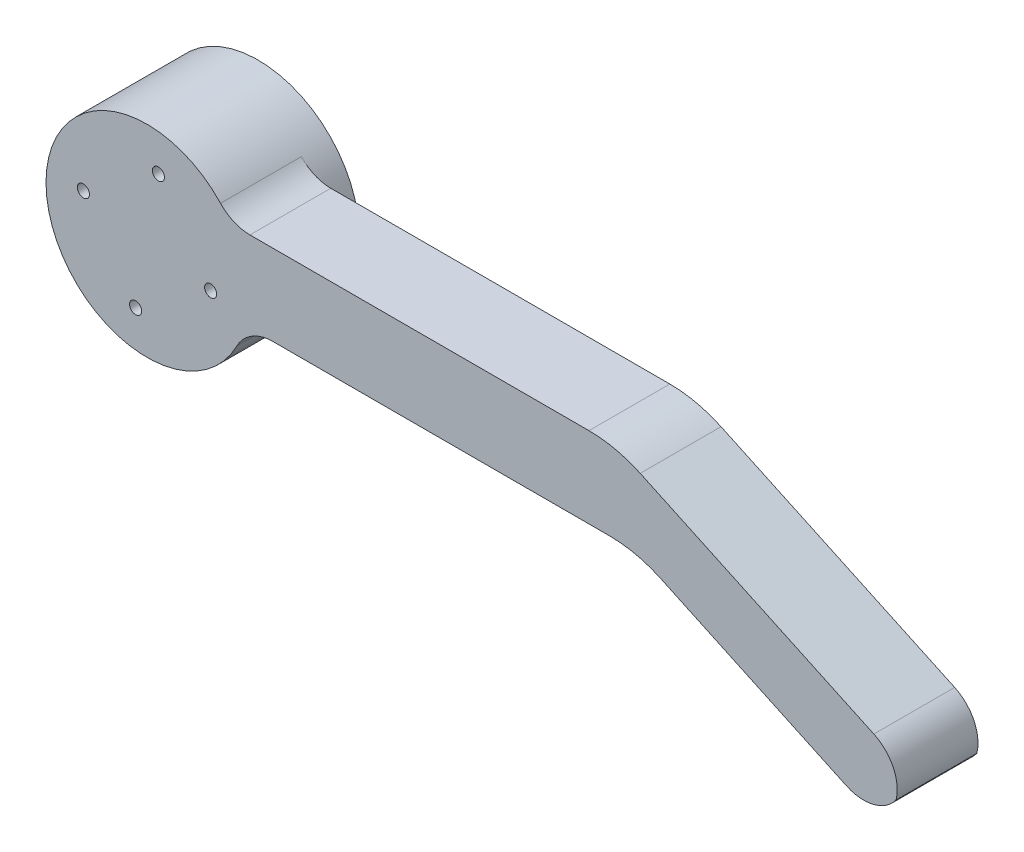
ISO-10303-21;
HEADER;
FILE_DESCRIPTION(('STEP AP214'),'2;1');
FILE_NAME('part.step','',(''),(''),'','','');
FILE_SCHEMA(('AUTOMOTIVE_DESIGN { 1 0 10303 214 1 1 1 1 }'));
ENDSEC;
DATA;
#1=APPLICATION_CONTEXT('core data for automotive mechanical design processes');
#2=APPLICATION_PROTOCOL_DEFINITION('international standard','automotive_design',2000,#1);
#3=PRODUCT_CONTEXT('',#1,'mechanical');
#4=PRODUCT('Part','Part','',(#3));
#5=PRODUCT_RELATED_PRODUCT_CATEGORY('part','',(#4));
#6=PRODUCT_DEFINITION_FORMATION('','',#4);
#7=PRODUCT_DEFINITION_CONTEXT('part definition',#1,'design');
#8=PRODUCT_DEFINITION('design','',#6,#7);
#9=PRODUCT_DEFINITION_SHAPE('','',#8);
#10=(LENGTH_UNIT() NAMED_UNIT(*) SI_UNIT(.MILLI.,.METRE.));
#11=(NAMED_UNIT(*) PLANE_ANGLE_UNIT() SI_UNIT($,.RADIAN.));
#12=(NAMED_UNIT(*) SI_UNIT($,.STERADIAN.) SOLID_ANGLE_UNIT());
#13=UNCERTAINTY_MEASURE_WITH_UNIT(LENGTH_MEASURE(1.E-05),#10,'distance_accuracy_value','');
#14=(GEOMETRIC_REPRESENTATION_CONTEXT(3) GLOBAL_UNCERTAINTY_ASSIGNED_CONTEXT((#13)) GLOBAL_UNIT_ASSIGNED_CONTEXT((#10,
#11,#12)) REPRESENTATION_CONTEXT('',''));
#15=CARTESIAN_POINT('',(0.,0.,0.));
#16=DIRECTION('',(0.,0.,1.));
#17=DIRECTION('',(1.,0.,0.));
#18=AXIS2_PLACEMENT_3D('',#15,#16,#17);
#19=CARTESIAN_POINT('',(0.,0.,-5.));
#20=DIRECTION('',(0.,0.,1.));
#21=DIRECTION('',(1.,0.,0.));
#22=AXIS2_PLACEMENT_3D('',#19,#20,#21);
#23=PLANE('',#22);
#24=CARTESIAN_POINT('',(7.87467997787572,-1.41046632217698,-5.));
#25=DIRECTION('',(0.,0.,-1.));
#26=DIRECTION('',(-1.,0.,0.));
#27=AXIS2_PLACEMENT_3D('',#24,#25,#26);
#28=CIRCLE('',#27,0.750000000000339);
#29=CARTESIAN_POINT('',(7.12467997787538,-1.41046632217698,-5.));
#30=VERTEX_POINT('',#29);
#31=EDGE_CURVE('E234',#30,#30,#28,.T.);
#32=ORIENTED_EDGE('',*,*,#31,.F.);
#33=EDGE_LOOP('',(#32));
#34=FACE_BOUND('',#33,.T.);
#35=CARTESIAN_POINT('',(-1.41046632217724,-7.87467997787591,-5.));
#36=DIRECTION('',(0.,0.,-1.));
#37=DIRECTION('',(-1.,0.,0.));
#38=AXIS2_PLACEMENT_3D('',#35,#36,#37);
#39=CIRCLE('',#38,0.750000000000507);
#40=CARTESIAN_POINT('',(-2.16046632217775,-7.87467997787591,-5.));
#41=VERTEX_POINT('',#40);
#42=EDGE_CURVE('E228',#41,#41,#39,.T.);
#43=ORIENTED_EDGE('',*,*,#42,.F.);
#44=EDGE_LOOP('',(#43));
#45=FACE_BOUND('',#44,.T.);
#46=CARTESIAN_POINT('',(-7.87467997787617,1.41046632217706,-5.));
#47=DIRECTION('',(0.,0.,-1.));
#48=DIRECTION('',(-1.,0.,0.));
#49=AXIS2_PLACEMENT_3D('',#46,#47,#48);
#50=CIRCLE('',#49,0.750000000000227);
#51=CARTESIAN_POINT('',(-8.6246799778764,1.41046632217706,-5.));
#52=VERTEX_POINT('',#51);
#53=EDGE_CURVE('E222',#52,#52,#50,.T.);
#54=ORIENTED_EDGE('',*,*,#53,.F.);
#55=EDGE_LOOP('',(#54));
#56=FACE_BOUND('',#55,.T.);
#57=CARTESIAN_POINT('',(1.41046632217679,7.87467997787599,-5.));
#58=DIRECTION('',(0.,0.,-1.));
#59=DIRECTION('',(-1.,0.,0.));
#60=AXIS2_PLACEMENT_3D('',#57,#58,#59);
#61=CIRCLE('',#60,0.75);
#62=CARTESIAN_POINT('',(0.660466322176793,7.87467997787599,-5.));
#63=VERTEX_POINT('',#62);
#64=EDGE_CURVE('E211',#63,#63,#61,.T.);
#65=ORIENTED_EDGE('',*,*,#64,.F.);
#66=EDGE_LOOP('',(#65));
#67=FACE_BOUND('',#66,.T.);
#68=CARTESIAN_POINT('',(0.,0.,-5.));
#69=DIRECTION('',(0.,0.,-1.));
#70=DIRECTION('',(-1.,0.,0.));
#71=AXIS2_PLACEMENT_3D('',#68,#69,#70);
#72=CIRCLE('',#71,10.5);
#73=CARTESIAN_POINT('',(-10.5,0.,-5.));
#74=VERTEX_POINT('',#73);
#75=EDGE_CURVE('E326',#74,#74,#72,.T.);
#76=ORIENTED_EDGE('',*,*,#75,.T.);
#77=EDGE_LOOP('',(#76));
#78=FACE_BOUND('',#77,.T.);
#79=ADVANCED_FACE('F33',(#34,#45,#56,#67,#78),#23,.F.);
#80=CARTESIAN_POINT('',(58.0156004897935,7.,5.));
#81=DIRECTION('',(-0.4226182617407,-0.90630778703665,0.));
#82=DIRECTION('',(0.90630778703665,-0.4226182617407,0.));
#83=AXIS2_PLACEMENT_3D('',#80,#81,#82);
#84=PLANE('',#83);
#85=DIRECTION('',(-0.90630778703665,0.4226182617407,0.));
#86=VECTOR('',#85,1.);
#87=CARTESIAN_POINT('',(58.0156004897935,7.,5.));
#88=LINE('',#87,#86);
#89=CARTESIAN_POINT('',(89.9406792032727,-7.8869086912965,5.));
#90=VERTEX_POINT('',#89);
#91=CARTESIAN_POINT('',(61.0294544762599,5.59461680554974,5.));
#92=VERTEX_POINT('',#91);
#93=EDGE_CURVE('E190',#90,#92,#88,.T.);
#94=ORIENTED_EDGE('',*,*,#93,.F.);
#95=DIRECTION('',(0.,0.,-1.));
#96=VECTOR('',#95,1.);
#97=CARTESIAN_POINT('',(89.9406792032727,-7.8869086912965,5.));
#98=LINE('',#97,#96);
#99=CARTESIAN_POINT('',(89.9406792032727,-7.8869086912965,-5.));
#100=VERTEX_POINT('',#99);
#101=EDGE_CURVE('E179',#90,#100,#98,.T.);
#102=ORIENTED_EDGE('',*,*,#101,.T.);
#103=DIRECTION('',(-0.90630778703665,0.4226182617407,0.));
#104=VECTOR('',#103,1.);
#105=CARTESIAN_POINT('',(58.0156004897935,7.,-5.));
#106=LINE('',#105,#104);
#107=CARTESIAN_POINT('',(61.0294544762599,5.59461680554974,-5.));
#108=VERTEX_POINT('',#107);
#109=EDGE_CURVE('E205',#100,#108,#106,.T.);
#110=ORIENTED_EDGE('',*,*,#109,.T.);
#111=DIRECTION('',(0.,0.,-1.));
#112=VECTOR('',#111,1.);
#113=CARTESIAN_POINT('',(61.0294544762599,5.59461680554974,5.));
#114=LINE('',#113,#112);
#115=EDGE_CURVE('E170',#108,#92,#114,.F.);
#116=ORIENTED_EDGE('',*,*,#115,.T.);
#117=EDGE_LOOP('',(#94,#102,#110,#116));
#118=FACE_BOUND('',#117,.T.);
#119=ADVANCED_FACE('F195',(#118),#84,.F.);
#120=CARTESIAN_POINT('',(10.356157588604,7.,5.));
#121=DIRECTION('',(0.,-1.,0.));
#122=DIRECTION('',(0.,0.,-1.));
#123=AXIS2_PLACEMENT_3D('',#120,#121,#122);
#124=PLANE('',#123);
#125=DIRECTION('',(-1.,0.,0.));
#126=VECTOR('',#125,1.);
#127=CARTESIAN_POINT('',(10.356157588604,7.,5.));
#128=LINE('',#127,#126);
#129=CARTESIAN_POINT('',(54.6901805501494,7.,5.));
#130=VERTEX_POINT('',#129);
#131=CARTESIAN_POINT('',(12.737739202857,7.,5.));
#132=VERTEX_POINT('',#131);
#133=EDGE_CURVE('E199',#130,#132,#128,.T.);
#134=ORIENTED_EDGE('',*,*,#133,.F.);
#135=DIRECTION('',(0.,0.,-1.));
#136=VECTOR('',#135,1.);
#137=CARTESIAN_POINT('',(54.6901805501494,7.,5.));
#138=LINE('',#137,#136);
#139=CARTESIAN_POINT('',(54.6901805501494,7.,-5.));
#140=VERTEX_POINT('',#139);
#141=EDGE_CURVE('E164',#130,#140,#138,.T.);
#142=ORIENTED_EDGE('',*,*,#141,.T.);
#143=DIRECTION('',(-1.,0.,0.));
#144=VECTOR('',#143,1.);
#145=CARTESIAN_POINT('',(10.356157588604,7.,-5.));
#146=LINE('',#145,#144);
#147=CARTESIAN_POINT('',(12.737739202857,7.,-5.));
#148=VERTEX_POINT('',#147);
#149=EDGE_CURVE('E208',#140,#148,#146,.T.);
#150=ORIENTED_EDGE('',*,*,#149,.T.);
#151=DIRECTION('',(0.,0.,1.));
#152=VECTOR('',#151,1.);
#153=CARTESIAN_POINT('',(12.737739202857,7.,5.));
#154=LINE('',#153,#152);
#155=EDGE_CURVE('E137',#148,#132,#154,.T.);
#156=ORIENTED_EDGE('',*,*,#155,.T.);
#157=EDGE_LOOP('',(#134,#142,#150,#156));
#158=FACE_BOUND('',#157,.T.);
#159=ADVANCED_FACE('F262',(#158),#124,.F.);
#160=CARTESIAN_POINT('',(0.,0.,5.));
#161=DIRECTION('',(0.,0.,-1.));
#162=DIRECTION('',(-1.,0.,0.));
#163=AXIS2_PLACEMENT_3D('',#160,#161,#162);
#164=CYLINDRICAL_SURFACE('',#163,12.5);
#165=CARTESIAN_POINT('',(0.,0.,5.));
#166=DIRECTION('',(0.,0.,1.));
#167=DIRECTION('',(1.,0.,0.));
#168=AXIS2_PLACEMENT_3D('',#165,#166,#167);
#169=CIRCLE('',#168,12.5);
#170=CARTESIAN_POINT('',(9.09838514489786,8.57142857142857,5.));
#171=VERTEX_POINT('',#170);
#172=CARTESIAN_POINT('',(11.1174160116238,-5.71428571428571,5.));
#173=VERTEX_POINT('',#172);
#174=EDGE_CURVE('E145',#171,#173,#169,.T.);
#175=ORIENTED_EDGE('',*,*,#174,.F.);
#176=DIRECTION('',(0.,0.,-1.));
#177=VECTOR('',#176,1.);
#178=CARTESIAN_POINT('',(9.09838514489786,8.57142857142857,5.));
#179=LINE('',#178,#177);
#180=CARTESIAN_POINT('',(9.09838514489786,8.57142857142857,-5.));
#181=VERTEX_POINT('',#180);
#182=EDGE_CURVE('E135',#171,#181,#179,.T.);
#183=ORIENTED_EDGE('',*,*,#182,.T.);
#184=CARTESIAN_POINT('',(0.,0.,-5.));
#185=DIRECTION('',(0.,0.,-1.));
#186=DIRECTION('',(-1.,0.,0.));
#187=AXIS2_PLACEMENT_3D('',#184,#185,#186);
#188=CIRCLE('',#187,12.5);
#189=CARTESIAN_POINT('',(11.1174160116238,-5.71428571428571,-5.));
#190=VERTEX_POINT('',#189);
#191=EDGE_CURVE('E117',#181,#190,#188,.T.);
#192=ORIENTED_EDGE('',*,*,#191,.T.);
#193=DIRECTION('',(0.,0.,-1.));
#194=VECTOR('',#193,1.);
#195=CARTESIAN_POINT('',(11.1174160116238,-5.71428571428571,5.));
#196=LINE('',#195,#194);
#197=EDGE_CURVE('E146',#190,#173,#196,.F.);
#198=ORIENTED_EDGE('',*,*,#197,.T.);
#199=EDGE_LOOP('',(#175,#183,#192,#198));
#200=FACE_BOUND('',#199,.T.);
#201=CARTESIAN_POINT('',(0.,0.,-8.75));
#202=DIRECTION('',(0.,0.,-1.));
#203=DIRECTION('',(-1.,0.,0.));
#204=AXIS2_PLACEMENT_3D('',#201,#202,#203);
#205=CIRCLE('',#204,12.5);
#206=CARTESIAN_POINT('',(-12.5,0.,-8.75));
#207=VERTEX_POINT('',#206);
#208=EDGE_CURVE('E128',#207,#207,#205,.T.);
#209=ORIENTED_EDGE('',*,*,#208,.F.);
#210=EDGE_LOOP('',(#209));
#211=FACE_BOUND('',#210,.T.);
#212=ADVANCED_FACE('F142',(#200,#211),#164,.T.);
#213=CARTESIAN_POINT('',(12.1346610995116,-3.,5.));
#214=DIRECTION('',(0.,1.,0.));
#215=DIRECTION('',(-1.,0.,0.));
#216=AXIS2_PLACEMENT_3D('',#213,#214,#215);
#217=PLANE('',#216);
#218=DIRECTION('',(1.,0.,0.));
#219=VECTOR('',#218,1.);
#220=CARTESIAN_POINT('',(12.1346610995116,-3.,-5.));
#221=LINE('',#220,#219);
#222=CARTESIAN_POINT('',(15.5643824162734,-3.,-5.));
#223=VERTEX_POINT('',#222);
#224=CARTESIAN_POINT('',(57.205637090025,-3.,-5.));
#225=VERTEX_POINT('',#224);
#226=EDGE_CURVE('E244',#223,#225,#221,.T.);
#227=ORIENTED_EDGE('',*,*,#226,.T.);
#228=DIRECTION('',(0.,0.,-1.));
#229=VECTOR('',#228,1.);
#230=CARTESIAN_POINT('',(57.205637090025,-3.,5.));
#231=LINE('',#230,#229);
#232=CARTESIAN_POINT('',(57.205637090025,-3.,5.));
#233=VERTEX_POINT('',#232);
#234=EDGE_CURVE('E162',#225,#233,#231,.F.);
#235=ORIENTED_EDGE('',*,*,#234,.T.);
#236=DIRECTION('',(1.,0.,0.));
#237=VECTOR('',#236,1.);
#238=CARTESIAN_POINT('',(12.1346610995116,-3.,5.));
#239=LINE('',#238,#237);
#240=CARTESIAN_POINT('',(15.5643824162734,-3.,5.));
#241=VERTEX_POINT('',#240);
#242=EDGE_CURVE('E239',#241,#233,#239,.T.);
#243=ORIENTED_EDGE('',*,*,#242,.F.);
#244=DIRECTION('',(0.,0.,1.));
#245=VECTOR('',#244,1.);
#246=CARTESIAN_POINT('',(15.5643824162734,-3.,-5.));
#247=LINE('',#246,#245);
#248=EDGE_CURVE('E139',#241,#223,#247,.F.);
#249=ORIENTED_EDGE('',*,*,#248,.T.);
#250=EDGE_LOOP('',(#227,#235,#243,#249));
#251=FACE_BOUND('',#250,.T.);
#252=ADVANCED_FACE('F251',(#251),#217,.F.);
#253=CARTESIAN_POINT('',(91.0912720445303,-17.2504622962932,5.));
#254=DIRECTION('',(0.4226182617407,0.90630778703665,0.));
#255=DIRECTION('',(-0.90630778703665,0.4226182617407,0.));
#256=AXIS2_PLACEMENT_3D('',#253,#254,#255);
#257=PLANE('',#256);
#258=DIRECTION('',(0.90630778703665,-0.4226182617407,0.));
#259=VECTOR('',#258,1.);
#260=CARTESIAN_POINT('',(91.0912720445303,-17.2504622962932,-5.));
#261=LINE('',#260,#259);
#262=CARTESIAN_POINT('',(63.5449110161355,-4.40538319445025,-5.));
#263=VERTEX_POINT('',#262);
#264=CARTESIAN_POINT('',(86.5597331093471,-15.1373709875897,-5.));
#265=VERTEX_POINT('',#264);
#266=EDGE_CURVE('E200',#263,#265,#261,.T.);
#267=ORIENTED_EDGE('',*,*,#266,.T.);
#268=DIRECTION('',(0.,0.,-1.));
#269=VECTOR('',#268,1.);
#270=CARTESIAN_POINT('',(86.5597331093471,-15.1373709875897,5.));
#271=LINE('',#270,#269);
#272=CARTESIAN_POINT('',(86.5597331093471,-15.1373709875897,5.));
#273=VERTEX_POINT('',#272);
#274=EDGE_CURVE('E11',#265,#273,#271,.F.);
#275=ORIENTED_EDGE('',*,*,#274,.T.);
#276=DIRECTION('',(0.90630778703665,-0.4226182617407,0.));
#277=VECTOR('',#276,1.);
#278=CARTESIAN_POINT('',(91.0912720445303,-17.2504622962932,5.));
#279=LINE('',#278,#277);
#280=CARTESIAN_POINT('',(63.5449110161355,-4.40538319445025,5.));
#281=VERTEX_POINT('',#280);
#282=EDGE_CURVE('E149',#281,#273,#279,.T.);
#283=ORIENTED_EDGE('',*,*,#282,.F.);
#284=DIRECTION('',(0.,0.,-1.));
#285=VECTOR('',#284,1.);
#286=CARTESIAN_POINT('',(63.5449110161355,-4.40538319445025,-5.));
#287=LINE('',#286,#285);
#288=EDGE_CURVE('E159',#281,#263,#287,.T.);
#289=ORIENTED_EDGE('',*,*,#288,.T.);
#290=EDGE_LOOP('',(#267,#275,#283,#289));
#291=FACE_BOUND('',#290,.T.);
#292=ADVANCED_FACE('F246',(#291),#257,.F.);
#293=CARTESIAN_POINT('',(0.,0.,5.));
#294=DIRECTION('',(0.,0.,1.));
#295=DIRECTION('',(1.,0.,0.));
#296=AXIS2_PLACEMENT_3D('',#293,#294,#295);
#297=PLANE('',#296);
#298=CARTESIAN_POINT('',(1.41046632217679,7.87467997787599,5.));
#299=DIRECTION('',(0.,0.,-1.));
#300=DIRECTION('',(-1.,0.,0.));
#301=AXIS2_PLACEMENT_3D('',#298,#299,#300);
#302=CIRCLE('',#301,0.75);
#303=CARTESIAN_POINT('',(0.660466322176793,7.87467997787599,5.));
#304=VERTEX_POINT('',#303);
#305=EDGE_CURVE('E207',#304,#304,#302,.T.);
#306=ORIENTED_EDGE('',*,*,#305,.T.);
#307=EDGE_LOOP('',(#306));
#308=FACE_BOUND('',#307,.T.);
#309=CARTESIAN_POINT('',(-7.87467997787617,1.41046632217706,5.));
#310=DIRECTION('',(0.,0.,-1.));
#311=DIRECTION('',(-1.,0.,0.));
#312=AXIS2_PLACEMENT_3D('',#309,#310,#311);
#313=CIRCLE('',#312,0.750000000000227);
#314=CARTESIAN_POINT('',(-8.6246799778764,1.41046632217706,5.));
#315=VERTEX_POINT('',#314);
#316=EDGE_CURVE('E216',#315,#315,#313,.T.);
#317=ORIENTED_EDGE('',*,*,#316,.T.);
#318=EDGE_LOOP('',(#317));
#319=FACE_BOUND('',#318,.T.);
#320=CARTESIAN_POINT('',(-1.41046632217724,-7.87467997787591,5.));
#321=DIRECTION('',(0.,0.,-1.));
#322=DIRECTION('',(-1.,0.,0.));
#323=AXIS2_PLACEMENT_3D('',#320,#321,#322);
#324=CIRCLE('',#323,0.750000000000507);
#325=CARTESIAN_POINT('',(-2.16046632217775,-7.87467997787591,5.));
#326=VERTEX_POINT('',#325);
#327=EDGE_CURVE('E225',#326,#326,#324,.T.);
#328=ORIENTED_EDGE('',*,*,#327,.T.);
#329=EDGE_LOOP('',(#328));
#330=FACE_BOUND('',#329,.T.);
#331=CARTESIAN_POINT('',(7.87467997787572,-1.41046632217698,5.));
#332=DIRECTION('',(0.,0.,-1.));
#333=DIRECTION('',(-1.,0.,0.));
#334=AXIS2_PLACEMENT_3D('',#331,#332,#333);
#335=CIRCLE('',#334,0.750000000000339);
#336=CARTESIAN_POINT('',(7.12467997787538,-1.41046632217698,5.));
#337=VERTEX_POINT('',#336);
#338=EDGE_CURVE('E231',#337,#337,#335,.T.);
#339=ORIENTED_EDGE('',*,*,#338,.T.);
#340=EDGE_LOOP('',(#339));
#341=FACE_BOUND('',#340,.T.);
#342=CARTESIAN_POINT('',(88.6728244180506,-10.6058320524064,5.));
#343=DIRECTION('',(0.,0.,1.));
#344=DIRECTION('',(1.,0.,0.));
#345=AXIS2_PLACEMENT_3D('',#342,#343,#344);
#346=CIRCLE('',#345,5.);
#347=CARTESIAN_POINT('',(92.6901894126115,-13.5825380339365,5.));
#348=VERTEX_POINT('',#347);
#349=EDGE_CURVE('E49',#273,#348,#346,.T.);
#350=ORIENTED_EDGE('',*,*,#349,.T.);
#351=CARTESIAN_POINT('',(87.8275878945692,-12.4184476264797,5.));
#352=DIRECTION('',(0.,0.,1.));
#353=DIRECTION('',(1.,0.,0.));
#354=AXIS2_PLACEMENT_3D('',#351,#352,#353);
#355=CIRCLE('',#354,5.);
#356=EDGE_CURVE('E42',#348,#90,#355,.T.);
#357=ORIENTED_EDGE('',*,*,#356,.T.);
#358=ORIENTED_EDGE('',*,*,#93,.T.);
#359=CARTESIAN_POINT('',(54.6901805501494,-8.,5.));
#360=DIRECTION('',(0.,0.,1.));
#361=DIRECTION('',(1.,0.,0.));
#362=AXIS2_PLACEMENT_3D('',#359,#360,#361);
#363=CIRCLE('',#362,15.);
#364=EDGE_CURVE('E173',#92,#130,#363,.T.);
#365=ORIENTED_EDGE('',*,*,#364,.T.);
#366=ORIENTED_EDGE('',*,*,#133,.T.);
#367=CARTESIAN_POINT('',(12.737739202857,12.,5.));
#368=DIRECTION('',(0.,0.,1.));
#369=DIRECTION('',(1.,0.,0.));
#370=AXIS2_PLACEMENT_3D('',#367,#368,#369);
#371=CIRCLE('',#370,5.);
#372=EDGE_CURVE('E138',#132,#171,#371,.F.);
#373=ORIENTED_EDGE('',*,*,#372,.T.);
#374=ORIENTED_EDGE('',*,*,#174,.T.);
#375=CARTESIAN_POINT('',(15.5643824162734,-8.,5.));
#376=DIRECTION('',(0.,0.,1.));
#377=DIRECTION('',(1.,0.,0.));
#378=AXIS2_PLACEMENT_3D('',#375,#376,#377);
#379=CIRCLE('',#378,5.);
#380=EDGE_CURVE('E157',#173,#241,#379,.F.);
#381=ORIENTED_EDGE('',*,*,#380,.T.);
#382=ORIENTED_EDGE('',*,*,#242,.T.);
#383=CARTESIAN_POINT('',(57.205637090025,-18.,5.));
#384=DIRECTION('',(0.,0.,1.));
#385=DIRECTION('',(1.,0.,0.));
#386=AXIS2_PLACEMENT_3D('',#383,#384,#385);
#387=CIRCLE('',#386,15.);
#388=EDGE_CURVE('E177',#233,#281,#387,.F.);
#389=ORIENTED_EDGE('',*,*,#388,.T.);
#390=ORIENTED_EDGE('',*,*,#282,.T.);
#391=EDGE_LOOP('',(#350,#357,#358,#365,#366,#373,#374,#381,#382,#389,#390));
#392=FACE_BOUND('',#391,.T.);
#393=ADVANCED_FACE('F189',(#308,#319,#330,#341,#392),#297,.T.);
#394=ORIENTED_EDGE('',*,*,#191,.F.);
#395=CARTESIAN_POINT('',(12.737739202857,12.,-5.));
#396=DIRECTION('',(0.,0.,1.));
#397=DIRECTION('',(1.,0.,0.));
#398=AXIS2_PLACEMENT_3D('',#395,#396,#397);
#399=CIRCLE('',#398,5.);
#400=EDGE_CURVE('E121',#181,#148,#399,.T.);
#401=ORIENTED_EDGE('',*,*,#400,.T.);
#402=ORIENTED_EDGE('',*,*,#149,.F.);
#403=CARTESIAN_POINT('',(54.6901805501494,-8.,-5.));
#404=DIRECTION('',(0.,0.,1.));
#405=DIRECTION('',(1.,0.,0.));
#406=AXIS2_PLACEMENT_3D('',#403,#404,#405);
#407=CIRCLE('',#406,15.);
#408=EDGE_CURVE('E167',#140,#108,#407,.F.);
#409=ORIENTED_EDGE('',*,*,#408,.T.);
#410=ORIENTED_EDGE('',*,*,#109,.F.);
#411=CARTESIAN_POINT('',(87.8275878945692,-12.4184476264797,-5.));
#412=DIRECTION('',(0.,0.,1.));
#413=DIRECTION('',(1.,0.,0.));
#414=AXIS2_PLACEMENT_3D('',#411,#412,#413);
#415=CIRCLE('',#414,5.);
#416=CARTESIAN_POINT('',(92.6901894126115,-13.5825380339365,-5.));
#417=VERTEX_POINT('',#416);
#418=EDGE_CURVE('E184',#100,#417,#415,.F.);
#419=ORIENTED_EDGE('',*,*,#418,.T.);
#420=CARTESIAN_POINT('',(88.6728244180506,-10.6058320524064,-5.));
#421=DIRECTION('',(0.,0.,1.));
#422=DIRECTION('',(1.,0.,0.));
#423=AXIS2_PLACEMENT_3D('',#420,#421,#422);
#424=CIRCLE('',#423,5.);
#425=EDGE_CURVE('E182',#417,#265,#424,.F.);
#426=ORIENTED_EDGE('',*,*,#425,.T.);
#427=ORIENTED_EDGE('',*,*,#266,.F.);
#428=CARTESIAN_POINT('',(57.205637090025,-18.,-5.));
#429=DIRECTION('',(0.,0.,1.));
#430=DIRECTION('',(1.,0.,0.));
#431=AXIS2_PLACEMENT_3D('',#428,#429,#430);
#432=CIRCLE('',#431,15.);
#433=EDGE_CURVE('E175',#263,#225,#432,.T.);
#434=ORIENTED_EDGE('',*,*,#433,.T.);
#435=ORIENTED_EDGE('',*,*,#226,.F.);
#436=CARTESIAN_POINT('',(15.5643824162734,-8.,-5.));
#437=DIRECTION('',(0.,0.,1.));
#438=DIRECTION('',(1.,0.,0.));
#439=AXIS2_PLACEMENT_3D('',#436,#437,#438);
#440=CIRCLE('',#439,5.);
#441=EDGE_CURVE('E124',#223,#190,#440,.T.);
#442=ORIENTED_EDGE('',*,*,#441,.T.);
#443=EDGE_LOOP('',(#394,#401,#402,#409,#410,#419,#426,#427,#434,#435,#442));
#444=FACE_BOUND('',#443,.T.);
#445=ADVANCED_FACE('F119',(#444),#23,.F.);
#446=CARTESIAN_POINT('',(12.737739202857,12.,5.));
#447=DIRECTION('',(0.,0.,-1.));
#448=DIRECTION('',(-1.,0.,0.));
#449=AXIS2_PLACEMENT_3D('',#446,#447,#448);
#450=CYLINDRICAL_SURFACE('',#449,5.);
#451=ORIENTED_EDGE('',*,*,#372,.F.);
#452=ORIENTED_EDGE('',*,*,#155,.F.);
#453=ORIENTED_EDGE('',*,*,#400,.F.);
#454=ORIENTED_EDGE('',*,*,#182,.F.);
#455=EDGE_LOOP('',(#451,#452,#453,#454));
#456=FACE_BOUND('',#455,.T.);
#457=ADVANCED_FACE('F134',(#456),#450,.F.);
#458=CARTESIAN_POINT('',(15.5643824162734,-8.,5.));
#459=DIRECTION('',(0.,0.,-1.));
#460=DIRECTION('',(-1.,0.,0.));
#461=AXIS2_PLACEMENT_3D('',#458,#459,#460);
#462=CYLINDRICAL_SURFACE('',#461,5.);
#463=ORIENTED_EDGE('',*,*,#380,.F.);
#464=ORIENTED_EDGE('',*,*,#197,.F.);
#465=ORIENTED_EDGE('',*,*,#441,.F.);
#466=ORIENTED_EDGE('',*,*,#248,.F.);
#467=EDGE_LOOP('',(#463,#464,#465,#466));
#468=FACE_BOUND('',#467,.T.);
#469=ADVANCED_FACE('F258',(#468),#462,.F.);
#470=CARTESIAN_POINT('',(57.205637090025,-18.,5.));
#471=DIRECTION('',(0.,0.,1.));
#472=DIRECTION('',(1.,0.,0.));
#473=AXIS2_PLACEMENT_3D('',#470,#471,#472);
#474=CYLINDRICAL_SURFACE('',#473,15.);
#475=ORIENTED_EDGE('',*,*,#388,.F.);
#476=ORIENTED_EDGE('',*,*,#234,.F.);
#477=ORIENTED_EDGE('',*,*,#433,.F.);
#478=ORIENTED_EDGE('',*,*,#288,.F.);
#479=EDGE_LOOP('',(#475,#476,#477,#478));
#480=FACE_BOUND('',#479,.T.);
#481=ADVANCED_FACE('F255',(#480),#474,.F.);
#482=CARTESIAN_POINT('',(54.6901805501494,-8.,5.));
#483=DIRECTION('',(0.,0.,-1.));
#484=DIRECTION('',(-1.,0.,0.));
#485=AXIS2_PLACEMENT_3D('',#482,#483,#484);
#486=CYLINDRICAL_SURFACE('',#485,15.);
#487=ORIENTED_EDGE('',*,*,#364,.F.);
#488=ORIENTED_EDGE('',*,*,#115,.F.);
#489=ORIENTED_EDGE('',*,*,#408,.F.);
#490=ORIENTED_EDGE('',*,*,#141,.F.);
#491=EDGE_LOOP('',(#487,#488,#489,#490));
#492=FACE_BOUND('',#491,.T.);
#493=ADVANCED_FACE('F264',(#492),#486,.T.);
#494=CARTESIAN_POINT('',(88.6728244180506,-10.6058320524064,5.));
#495=DIRECTION('',(0.,0.,-1.));
#496=DIRECTION('',(-1.,0.,0.));
#497=AXIS2_PLACEMENT_3D('',#494,#495,#496);
#498=CYLINDRICAL_SURFACE('',#497,5.);
#499=DIRECTION('',(0.,0.,-1.));
#500=VECTOR('',#499,1.);
#501=CARTESIAN_POINT('',(92.6901894126115,-13.5825380339365,0.));
#502=LINE('',#501,#500);
#503=EDGE_CURVE('E37',#348,#417,#502,.T.);
#504=ORIENTED_EDGE('',*,*,#503,.F.);
#505=ORIENTED_EDGE('',*,*,#349,.F.);
#506=ORIENTED_EDGE('',*,*,#274,.F.);
#507=ORIENTED_EDGE('',*,*,#425,.F.);
#508=EDGE_LOOP('',(#504,#505,#506,#507));
#509=FACE_BOUND('',#508,.T.);
#510=ADVANCED_FACE('F35',(#509),#498,.T.);
#511=CARTESIAN_POINT('',(87.8275878945692,-12.4184476264797,5.));
#512=DIRECTION('',(0.,0.,-1.));
#513=DIRECTION('',(-1.,0.,0.));
#514=AXIS2_PLACEMENT_3D('',#511,#512,#513);
#515=CYLINDRICAL_SURFACE('',#514,5.);
#516=ORIENTED_EDGE('',*,*,#356,.F.);
#517=ORIENTED_EDGE('',*,*,#503,.T.);
#518=ORIENTED_EDGE('',*,*,#418,.F.);
#519=ORIENTED_EDGE('',*,*,#101,.F.);
#520=EDGE_LOOP('',(#516,#517,#518,#519));
#521=FACE_BOUND('',#520,.T.);
#522=ADVANCED_FACE('F202',(#521),#515,.T.);
#523=CARTESIAN_POINT('',(7.87467997787572,-1.41046632217698,5.));
#524=DIRECTION('',(0.,0.,-1.));
#525=DIRECTION('',(-1.,0.,0.));
#526=AXIS2_PLACEMENT_3D('',#523,#524,#525);
#527=CYLINDRICAL_SURFACE('',#526,0.750000000000339);
#528=ORIENTED_EDGE('',*,*,#338,.F.);
#529=EDGE_LOOP('',(#528));
#530=FACE_BOUND('',#529,.T.);
#531=ORIENTED_EDGE('',*,*,#31,.T.);
#532=EDGE_LOOP('',(#531));
#533=FACE_BOUND('',#532,.T.);
#534=ADVANCED_FACE('F296',(#530,#533),#527,.F.);
#535=CARTESIAN_POINT('',(-1.41046632217724,-7.87467997787591,5.));
#536=DIRECTION('',(0.,0.,-1.));
#537=DIRECTION('',(-1.,0.,0.));
#538=AXIS2_PLACEMENT_3D('',#535,#536,#537);
#539=CYLINDRICAL_SURFACE('',#538,0.750000000000507);
#540=ORIENTED_EDGE('',*,*,#327,.F.);
#541=EDGE_LOOP('',(#540));
#542=FACE_BOUND('',#541,.T.);
#543=ORIENTED_EDGE('',*,*,#42,.T.);
#544=EDGE_LOOP('',(#543));
#545=FACE_BOUND('',#544,.T.);
#546=ADVANCED_FACE('F299',(#542,#545),#539,.F.);
#547=CARTESIAN_POINT('',(-7.87467997787617,1.41046632217706,5.));
#548=DIRECTION('',(0.,0.,-1.));
#549=DIRECTION('',(-1.,0.,0.));
#550=AXIS2_PLACEMENT_3D('',#547,#548,#549);
#551=CYLINDRICAL_SURFACE('',#550,0.750000000000227);
#552=ORIENTED_EDGE('',*,*,#316,.F.);
#553=EDGE_LOOP('',(#552));
#554=FACE_BOUND('',#553,.T.);
#555=ORIENTED_EDGE('',*,*,#53,.T.);
#556=EDGE_LOOP('',(#555));
#557=FACE_BOUND('',#556,.T.);
#558=ADVANCED_FACE('F303',(#554,#557),#551,.F.);
#559=CARTESIAN_POINT('',(1.41046632217679,7.87467997787599,5.));
#560=DIRECTION('',(0.,0.,-1.));
#561=DIRECTION('',(-1.,0.,0.));
#562=AXIS2_PLACEMENT_3D('',#559,#560,#561);
#563=CYLINDRICAL_SURFACE('',#562,0.75);
#564=ORIENTED_EDGE('',*,*,#305,.F.);
#565=EDGE_LOOP('',(#564));
#566=FACE_BOUND('',#565,.T.);
#567=ORIENTED_EDGE('',*,*,#64,.T.);
#568=EDGE_LOOP('',(#567));
#569=FACE_BOUND('',#568,.T.);
#570=ADVANCED_FACE('F307',(#566,#569),#563,.F.);
#571=CARTESIAN_POINT('',(0.,0.,-8.75));
#572=DIRECTION('',(0.,0.,-1.));
#573=DIRECTION('',(-1.,0.,0.));
#574=AXIS2_PLACEMENT_3D('',#571,#572,#573);
#575=PLANE('',#574);
#576=ORIENTED_EDGE('',*,*,#208,.T.);
#577=EDGE_LOOP('',(#576));
#578=FACE_BOUND('',#577,.T.);
#579=CARTESIAN_POINT('',(0.,0.,-8.75));
#580=DIRECTION('',(0.,0.,-1.));
#581=DIRECTION('',(-1.,0.,0.));
#582=AXIS2_PLACEMENT_3D('',#579,#580,#581);
#583=CIRCLE('',#582,10.5);
#584=CARTESIAN_POINT('',(-10.5,0.,-8.75));
#585=VERTEX_POINT('',#584);
#586=EDGE_CURVE('E129',#585,#585,#583,.T.);
#587=ORIENTED_EDGE('',*,*,#586,.F.);
#588=EDGE_LOOP('',(#587));
#589=FACE_BOUND('',#588,.T.);
#590=ADVANCED_FACE('F311',(#578,#589),#575,.T.);
#591=CARTESIAN_POINT('',(0.,0.,-8.75));
#592=DIRECTION('',(0.,0.,1.));
#593=DIRECTION('',(1.,0.,0.));
#594=AXIS2_PLACEMENT_3D('',#591,#592,#593);
#595=CYLINDRICAL_SURFACE('',#594,10.5);
#596=ORIENTED_EDGE('',*,*,#586,.T.);
#597=EDGE_LOOP('',(#596));
#598=FACE_BOUND('',#597,.T.);
#599=ORIENTED_EDGE('',*,*,#75,.F.);
#600=EDGE_LOOP('',(#599));
#601=FACE_BOUND('',#600,.T.);
#602=ADVANCED_FACE('F315',(#598,#601),#595,.F.);
#603=CLOSED_SHELL('',(#79,#119,#159,#212,#252,#292,#393,#445,#457,#469,#481,#493,#510,#522,#534,
#546,#558,#570,#590,#602));
#604=MANIFOLD_SOLID_BREP('B2',#603);
#605=ADVANCED_BREP_SHAPE_REPRESENTATION('',(#18,#604),#14);
#606=SHAPE_DEFINITION_REPRESENTATION(#9,#605);
ENDSEC;
END-ISO-10303-21;
